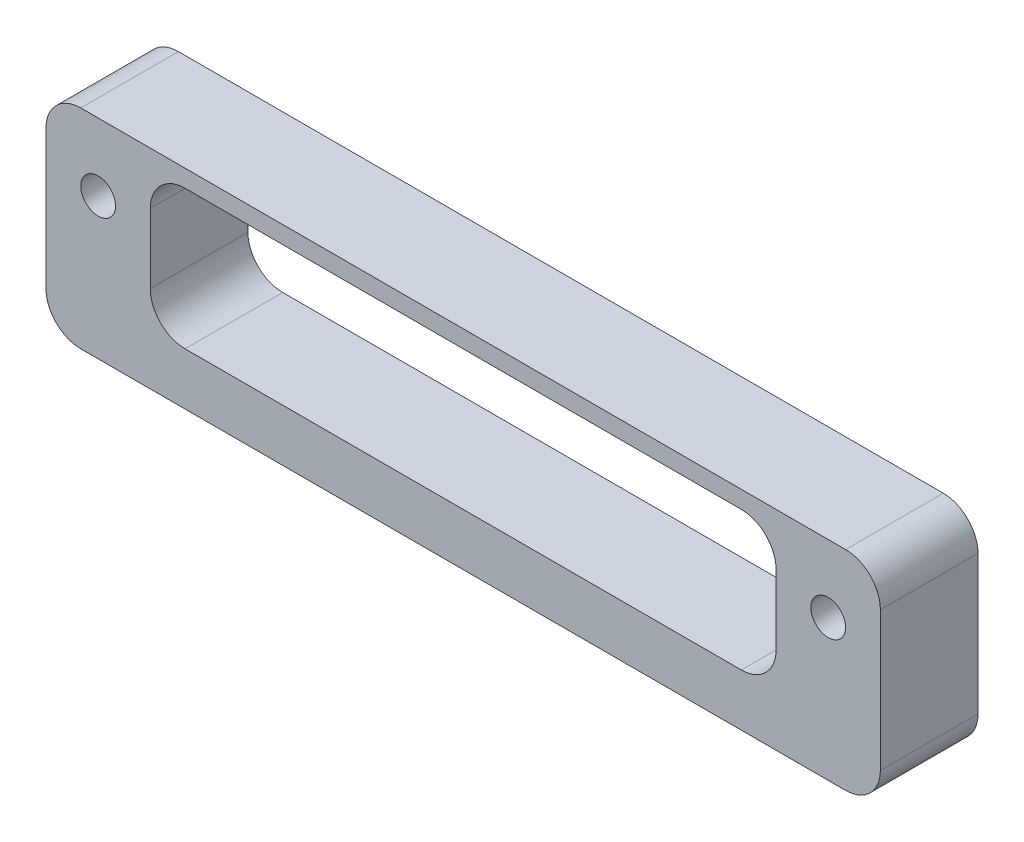
ISO-10303-21;
HEADER;
FILE_DESCRIPTION(('STEP AP214'),'2;1');
FILE_NAME('part.step','',(''),(''),'','','');
FILE_SCHEMA(('AUTOMOTIVE_DESIGN { 1 0 10303 214 1 1 1 1 }'));
ENDSEC;
DATA;
#1=APPLICATION_CONTEXT('core data for automotive mechanical design processes');
#2=APPLICATION_PROTOCOL_DEFINITION('international standard','automotive_design',2000,#1);
#3=PRODUCT_CONTEXT('',#1,'mechanical');
#4=PRODUCT('Part','Part','',(#3));
#5=PRODUCT_RELATED_PRODUCT_CATEGORY('part','',(#4));
#6=PRODUCT_DEFINITION_FORMATION('','',#4);
#7=PRODUCT_DEFINITION_CONTEXT('part definition',#1,'design');
#8=PRODUCT_DEFINITION('design','',#6,#7);
#9=PRODUCT_DEFINITION_SHAPE('','',#8);
#10=(LENGTH_UNIT() NAMED_UNIT(*) SI_UNIT(.MILLI.,.METRE.));
#11=(NAMED_UNIT(*) PLANE_ANGLE_UNIT() SI_UNIT($,.RADIAN.));
#12=(NAMED_UNIT(*) SI_UNIT($,.STERADIAN.) SOLID_ANGLE_UNIT());
#13=UNCERTAINTY_MEASURE_WITH_UNIT(LENGTH_MEASURE(1.E-05),#10,'distance_accuracy_value','');
#14=(GEOMETRIC_REPRESENTATION_CONTEXT(3) GLOBAL_UNCERTAINTY_ASSIGNED_CONTEXT((#13)) GLOBAL_UNIT_ASSIGNED_CONTEXT((#10,
#11,#12)) REPRESENTATION_CONTEXT('',''));
#15=CARTESIAN_POINT('',(0.,0.,0.));
#16=DIRECTION('',(0.,0.,1.));
#17=DIRECTION('',(1.,0.,0.));
#18=AXIS2_PLACEMENT_3D('',#15,#16,#17);
#19=CARTESIAN_POINT('',(-76.2,-19.05,17.8308));
#20=DIRECTION('',(1.,0.,0.));
#21=DIRECTION('',(0.,0.,-1.));
#22=AXIS2_PLACEMENT_3D('',#19,#20,#21);
#23=PLANE('',#22);
#24=DIRECTION('',(0.,-1.,0.));
#25=VECTOR('',#24,1.);
#26=CARTESIAN_POINT('',(-76.2,-19.05,0.));
#27=LINE('',#26,#25);
#28=CARTESIAN_POINT('',(-76.2,12.7,0.));
#29=VERTEX_POINT('',#28);
#30=CARTESIAN_POINT('',(-76.2,-12.7,0.));
#31=VERTEX_POINT('',#30);
#32=EDGE_CURVE('E177',#29,#31,#27,.T.);
#33=ORIENTED_EDGE('',*,*,#32,.T.);
#34=DIRECTION('',(0.,0.,-1.));
#35=VECTOR('',#34,1.);
#36=CARTESIAN_POINT('',(-76.2,-12.7,17.8308));
#37=LINE('',#36,#35);
#38=CARTESIAN_POINT('',(-76.2,-12.7,17.8308));
#39=VERTEX_POINT('',#38);
#40=EDGE_CURVE('E154',#31,#39,#37,.F.);
#41=ORIENTED_EDGE('',*,*,#40,.T.);
#42=DIRECTION('',(0.,-1.,0.));
#43=VECTOR('',#42,1.);
#44=CARTESIAN_POINT('',(-76.2,-19.05,17.8308));
#45=LINE('',#44,#43);
#46=CARTESIAN_POINT('',(-76.2,12.7,17.8308));
#47=VERTEX_POINT('',#46);
#48=EDGE_CURVE('E187',#47,#39,#45,.T.);
#49=ORIENTED_EDGE('',*,*,#48,.F.);
#50=DIRECTION('',(0.,0.,-1.));
#51=VECTOR('',#50,1.);
#52=CARTESIAN_POINT('',(-76.2,12.7,17.8308));
#53=LINE('',#52,#51);
#54=EDGE_CURVE('E159',#47,#29,#53,.T.);
#55=ORIENTED_EDGE('',*,*,#54,.T.);
#56=EDGE_LOOP('',(#33,#41,#49,#55));
#57=FACE_BOUND('',#56,.T.);
#58=ADVANCED_FACE('F35',(#57),#23,.F.);
#59=CARTESIAN_POINT('',(76.2,-19.05,17.8308));
#60=DIRECTION('',(0.,1.,0.));
#61=DIRECTION('',(-1.,0.,0.));
#62=AXIS2_PLACEMENT_3D('',#59,#60,#61);
#63=PLANE('',#62);
#64=DIRECTION('',(1.,0.,0.));
#65=VECTOR('',#64,1.);
#66=CARTESIAN_POINT('',(76.2,-19.05,17.8308));
#67=LINE('',#66,#65);
#68=CARTESIAN_POINT('',(-69.85,-19.05,17.8308));
#69=VERTEX_POINT('',#68);
#70=CARTESIAN_POINT('',(69.85,-19.05,17.8308));
#71=VERTEX_POINT('',#70);
#72=EDGE_CURVE('E169',#69,#71,#67,.T.);
#73=ORIENTED_EDGE('',*,*,#72,.F.);
#74=DIRECTION('',(0.,0.,-1.));
#75=VECTOR('',#74,1.);
#76=CARTESIAN_POINT('',(-69.85,-19.05,17.8308));
#77=LINE('',#76,#75);
#78=CARTESIAN_POINT('',(-69.85,-19.05,0.));
#79=VERTEX_POINT('',#78);
#80=EDGE_CURVE('E153',#69,#79,#77,.T.);
#81=ORIENTED_EDGE('',*,*,#80,.T.);
#82=DIRECTION('',(1.,0.,0.));
#83=VECTOR('',#82,1.);
#84=CARTESIAN_POINT('',(76.2,-19.05,0.));
#85=LINE('',#84,#83);
#86=CARTESIAN_POINT('',(69.85,-19.05,0.));
#87=VERTEX_POINT('',#86);
#88=EDGE_CURVE('E166',#79,#87,#85,.T.);
#89=ORIENTED_EDGE('',*,*,#88,.T.);
#90=DIRECTION('',(0.,0.,-1.));
#91=VECTOR('',#90,1.);
#92=CARTESIAN_POINT('',(69.85,-19.05,17.8308));
#93=LINE('',#92,#91);
#94=EDGE_CURVE('E171',#87,#71,#93,.F.);
#95=ORIENTED_EDGE('',*,*,#94,.T.);
#96=EDGE_LOOP('',(#73,#81,#89,#95));
#97=FACE_BOUND('',#96,.T.);
#98=ADVANCED_FACE('F165',(#97),#63,.F.);
#99=CARTESIAN_POINT('',(76.2,-19.05,17.8308));
#100=DIRECTION('',(-1.,0.,0.));
#101=DIRECTION('',(0.,0.,1.));
#102=AXIS2_PLACEMENT_3D('',#99,#100,#101);
#103=PLANE('',#102);
#104=DIRECTION('',(0.,1.,0.));
#105=VECTOR('',#104,1.);
#106=CARTESIAN_POINT('',(76.2,-19.05,17.8308));
#107=LINE('',#106,#105);
#108=CARTESIAN_POINT('',(76.2,-12.7,17.8308));
#109=VERTEX_POINT('',#108);
#110=CARTESIAN_POINT('',(76.2,12.7,17.8308));
#111=VERTEX_POINT('',#110);
#112=EDGE_CURVE('E292',#109,#111,#107,.T.);
#113=ORIENTED_EDGE('',*,*,#112,.F.);
#114=DIRECTION('',(0.,0.,-1.));
#115=VECTOR('',#114,1.);
#116=CARTESIAN_POINT('',(76.2,-12.7,17.8308));
#117=LINE('',#116,#115);
#118=CARTESIAN_POINT('',(76.2,-12.7,0.));
#119=VERTEX_POINT('',#118);
#120=EDGE_CURVE('E224',#109,#119,#117,.T.);
#121=ORIENTED_EDGE('',*,*,#120,.T.);
#122=DIRECTION('',(0.,1.,0.));
#123=VECTOR('',#122,1.);
#124=CARTESIAN_POINT('',(76.2,-19.05,0.));
#125=LINE('',#124,#123);
#126=CARTESIAN_POINT('',(76.2,12.7,0.));
#127=VERTEX_POINT('',#126);
#128=EDGE_CURVE('E176',#119,#127,#125,.T.);
#129=ORIENTED_EDGE('',*,*,#128,.T.);
#130=DIRECTION('',(0.,0.,-1.));
#131=VECTOR('',#130,1.);
#132=CARTESIAN_POINT('',(76.2,12.7,17.8308));
#133=LINE('',#132,#131);
#134=EDGE_CURVE('E222',#127,#111,#133,.F.);
#135=ORIENTED_EDGE('',*,*,#134,.T.);
#136=EDGE_LOOP('',(#113,#121,#129,#135));
#137=FACE_BOUND('',#136,.T.);
#138=ADVANCED_FACE('F307',(#137),#103,.F.);
#139=CARTESIAN_POINT('',(76.2,19.05,17.8308));
#140=DIRECTION('',(0.,-1.,0.));
#141=DIRECTION('',(1.,0.,0.));
#142=AXIS2_PLACEMENT_3D('',#139,#140,#141);
#143=PLANE('',#142);
#144=DIRECTION('',(-1.,0.,0.));
#145=VECTOR('',#144,1.);
#146=CARTESIAN_POINT('',(76.2,19.05,0.));
#147=LINE('',#146,#145);
#148=CARTESIAN_POINT('',(69.85,19.05,0.));
#149=VERTEX_POINT('',#148);
#150=CARTESIAN_POINT('',(-69.85,19.05,0.));
#151=VERTEX_POINT('',#150);
#152=EDGE_CURVE('E180',#149,#151,#147,.T.);
#153=ORIENTED_EDGE('',*,*,#152,.T.);
#154=DIRECTION('',(0.,0.,-1.));
#155=VECTOR('',#154,1.);
#156=CARTESIAN_POINT('',(-69.85,19.05,17.8308));
#157=LINE('',#156,#155);
#158=CARTESIAN_POINT('',(-69.85,19.05,17.8308));
#159=VERTEX_POINT('',#158);
#160=EDGE_CURVE('E50',#151,#159,#157,.F.);
#161=ORIENTED_EDGE('',*,*,#160,.T.);
#162=DIRECTION('',(-1.,0.,0.));
#163=VECTOR('',#162,1.);
#164=CARTESIAN_POINT('',(76.2,19.05,17.8308));
#165=LINE('',#164,#163);
#166=CARTESIAN_POINT('',(69.85,19.05,17.8308));
#167=VERTEX_POINT('',#166);
#168=EDGE_CURVE('E188',#167,#159,#165,.T.);
#169=ORIENTED_EDGE('',*,*,#168,.F.);
#170=DIRECTION('',(0.,0.,-1.));
#171=VECTOR('',#170,1.);
#172=CARTESIAN_POINT('',(69.85,19.05,17.8308));
#173=LINE('',#172,#171);
#174=EDGE_CURVE('E203',#167,#149,#173,.T.);
#175=ORIENTED_EDGE('',*,*,#174,.T.);
#176=EDGE_LOOP('',(#153,#161,#169,#175));
#177=FACE_BOUND('',#176,.T.);
#178=ADVANCED_FACE('F301',(#177),#143,.F.);
#179=CARTESIAN_POINT('',(0.,0.,17.8308));
#180=DIRECTION('',(0.,0.,1.));
#181=DIRECTION('',(1.,0.,0.));
#182=AXIS2_PLACEMENT_3D('',#179,#180,#181);
#183=PLANE('',#182);
#184=CARTESIAN_POINT('',(66.675,6.71301999999999,17.8308));
#185=DIRECTION('',(0.,0.,1.));
#186=DIRECTION('',(1.,0.,0.));
#187=AXIS2_PLACEMENT_3D('',#184,#185,#186);
#188=CIRCLE('',#187,3.175);
#189=CARTESIAN_POINT('',(69.85,6.71301999999999,17.8308));
#190=VERTEX_POINT('',#189);
#191=EDGE_CURVE('E505',#190,#190,#188,.T.);
#192=ORIENTED_EDGE('',*,*,#191,.F.);
#193=EDGE_LOOP('',(#192));
#194=FACE_BOUND('',#193,.T.);
#195=CARTESIAN_POINT('',(-66.675,6.71301999999999,17.8308));
#196=DIRECTION('',(0.,0.,1.));
#197=DIRECTION('',(1.,0.,0.));
#198=AXIS2_PLACEMENT_3D('',#195,#196,#197);
#199=CIRCLE('',#198,3.175);
#200=CARTESIAN_POINT('',(-63.5,6.71301999999999,17.8308));
#201=VERTEX_POINT('',#200);
#202=EDGE_CURVE('E277',#201,#201,#199,.T.);
#203=ORIENTED_EDGE('',*,*,#202,.F.);
#204=EDGE_LOOP('',(#203));
#205=FACE_BOUND('',#204,.T.);
#206=DIRECTION('',(0.,-1.,0.));
#207=VECTOR('',#206,1.);
#208=CARTESIAN_POINT('',(-57.15,15.875,17.8308));
#209=LINE('',#208,#207);
#210=CARTESIAN_POINT('',(-57.15,9.52499999999999,17.8308));
#211=VERTEX_POINT('',#210);
#212=CARTESIAN_POINT('',(-57.15,-3.17500000000001,17.8308));
#213=VERTEX_POINT('',#212);
#214=EDGE_CURVE('E250',#211,#213,#209,.T.);
#215=ORIENTED_EDGE('',*,*,#214,.F.);
#216=CARTESIAN_POINT('',(-50.8,9.52499999999999,17.8308));
#217=DIRECTION('',(0.,0.,1.));
#218=DIRECTION('',(1.,0.,0.));
#219=AXIS2_PLACEMENT_3D('',#216,#217,#218);
#220=CIRCLE('',#219,6.35);
#221=CARTESIAN_POINT('',(-50.8,15.875,17.8308));
#222=VERTEX_POINT('',#221);
#223=EDGE_CURVE('E43',#211,#222,#220,.F.);
#224=ORIENTED_EDGE('',*,*,#223,.T.);
#225=DIRECTION('',(-1.,0.,0.));
#226=VECTOR('',#225,1.);
#227=CARTESIAN_POINT('',(-57.15,15.875,17.8308));
#228=LINE('',#227,#226);
#229=CARTESIAN_POINT('',(50.8,15.875,17.8308));
#230=VERTEX_POINT('',#229);
#231=EDGE_CURVE('E248',#230,#222,#228,.T.);
#232=ORIENTED_EDGE('',*,*,#231,.F.);
#233=CARTESIAN_POINT('',(50.8,9.525,17.8308));
#234=DIRECTION('',(0.,0.,1.));
#235=DIRECTION('',(1.,0.,0.));
#236=AXIS2_PLACEMENT_3D('',#233,#234,#235);
#237=CIRCLE('',#236,6.35);
#238=CARTESIAN_POINT('',(57.15,9.525,17.8308));
#239=VERTEX_POINT('',#238);
#240=EDGE_CURVE('E240',#230,#239,#237,.F.);
#241=ORIENTED_EDGE('',*,*,#240,.T.);
#242=DIRECTION('',(0.,1.,0.));
#243=VECTOR('',#242,1.);
#244=CARTESIAN_POINT('',(57.15,15.875,17.8308));
#245=LINE('',#244,#243);
#246=CARTESIAN_POINT('',(57.15,-3.175,17.8308));
#247=VERTEX_POINT('',#246);
#248=EDGE_CURVE('E260',#247,#239,#245,.T.);
#249=ORIENTED_EDGE('',*,*,#248,.F.);
#250=CARTESIAN_POINT('',(50.8,-3.175,17.8308));
#251=DIRECTION('',(0.,0.,1.));
#252=DIRECTION('',(1.,0.,0.));
#253=AXIS2_PLACEMENT_3D('',#250,#251,#252);
#254=CIRCLE('',#253,6.35);
#255=CARTESIAN_POINT('',(50.8,-9.525,17.8308));
#256=VERTEX_POINT('',#255);
#257=EDGE_CURVE('E236',#247,#256,#254,.F.);
#258=ORIENTED_EDGE('',*,*,#257,.T.);
#259=DIRECTION('',(1.,0.,0.));
#260=VECTOR('',#259,1.);
#261=CARTESIAN_POINT('',(-57.15,-9.52500000000001,17.8308));
#262=LINE('',#261,#260);
#263=CARTESIAN_POINT('',(-50.8,-9.52500000000001,17.8308));
#264=VERTEX_POINT('',#263);
#265=EDGE_CURVE('E283',#264,#256,#262,.T.);
#266=ORIENTED_EDGE('',*,*,#265,.F.);
#267=CARTESIAN_POINT('',(-50.8,-3.17500000000001,17.8308));
#268=DIRECTION('',(0.,0.,1.));
#269=DIRECTION('',(1.,0.,0.));
#270=AXIS2_PLACEMENT_3D('',#267,#268,#269);
#271=CIRCLE('',#270,6.35);
#272=EDGE_CURVE('E232',#264,#213,#271,.F.);
#273=ORIENTED_EDGE('',*,*,#272,.T.);
#274=EDGE_LOOP('',(#215,#224,#232,#241,#249,#258,#266,#273));
#275=FACE_BOUND('',#274,.T.);
#276=ORIENTED_EDGE('',*,*,#48,.T.);
#277=CARTESIAN_POINT('',(-69.85,-12.7,17.8308));
#278=DIRECTION('',(0.,0.,1.));
#279=DIRECTION('',(1.,0.,0.));
#280=AXIS2_PLACEMENT_3D('',#277,#278,#279);
#281=CIRCLE('',#280,6.35);
#282=EDGE_CURVE('E201',#39,#69,#281,.T.);
#283=ORIENTED_EDGE('',*,*,#282,.T.);
#284=ORIENTED_EDGE('',*,*,#72,.T.);
#285=CARTESIAN_POINT('',(69.85,-12.7,17.8308));
#286=DIRECTION('',(0.,0.,1.));
#287=DIRECTION('',(1.,0.,0.));
#288=AXIS2_PLACEMENT_3D('',#285,#286,#287);
#289=CIRCLE('',#288,6.35);
#290=EDGE_CURVE('E197',#71,#109,#289,.T.);
#291=ORIENTED_EDGE('',*,*,#290,.T.);
#292=ORIENTED_EDGE('',*,*,#112,.T.);
#293=CARTESIAN_POINT('',(69.85,12.7,17.8308));
#294=DIRECTION('',(0.,0.,1.));
#295=DIRECTION('',(1.,0.,0.));
#296=AXIS2_PLACEMENT_3D('',#293,#294,#295);
#297=CIRCLE('',#296,6.35);
#298=EDGE_CURVE('E57',#111,#167,#297,.T.);
#299=ORIENTED_EDGE('',*,*,#298,.T.);
#300=ORIENTED_EDGE('',*,*,#168,.T.);
#301=CARTESIAN_POINT('',(-69.85,12.7,17.8308));
#302=DIRECTION('',(0.,0.,1.));
#303=DIRECTION('',(1.,0.,0.));
#304=AXIS2_PLACEMENT_3D('',#301,#302,#303);
#305=CIRCLE('',#304,6.35);
#306=EDGE_CURVE('E199',#159,#47,#305,.T.);
#307=ORIENTED_EDGE('',*,*,#306,.T.);
#308=EDGE_LOOP('',(#276,#283,#284,#291,#292,#299,#300,#307));
#309=FACE_BOUND('',#308,.T.);
#310=ADVANCED_FACE('F247',(#194,#205,#275,#309),#183,.T.);
#311=CARTESIAN_POINT('',(0.,0.,0.));
#312=DIRECTION('',(0.,0.,1.));
#313=DIRECTION('',(1.,0.,0.));
#314=AXIS2_PLACEMENT_3D('',#311,#312,#313);
#315=PLANE('',#314);
#316=CARTESIAN_POINT('',(66.675,6.71301999999999,0.));
#317=DIRECTION('',(0.,0.,1.));
#318=DIRECTION('',(1.,0.,0.));
#319=AXIS2_PLACEMENT_3D('',#316,#317,#318);
#320=CIRCLE('',#319,3.175);
#321=CARTESIAN_POINT('',(69.85,6.71301999999999,0.));
#322=VERTEX_POINT('',#321);
#323=EDGE_CURVE('E501',#322,#322,#320,.T.);
#324=ORIENTED_EDGE('',*,*,#323,.T.);
#325=EDGE_LOOP('',(#324));
#326=FACE_BOUND('',#325,.T.);
#327=CARTESIAN_POINT('',(-66.675,6.71301999999999,0.));
#328=DIRECTION('',(0.,0.,1.));
#329=DIRECTION('',(1.,0.,0.));
#330=AXIS2_PLACEMENT_3D('',#327,#328,#329);
#331=CIRCLE('',#330,3.175);
#332=CARTESIAN_POINT('',(-63.5,6.71301999999999,0.));
#333=VERTEX_POINT('',#332);
#334=EDGE_CURVE('E284',#333,#333,#331,.T.);
#335=ORIENTED_EDGE('',*,*,#334,.T.);
#336=EDGE_LOOP('',(#335));
#337=FACE_BOUND('',#336,.T.);
#338=DIRECTION('',(0.,1.,0.));
#339=VECTOR('',#338,1.);
#340=CARTESIAN_POINT('',(57.15,15.875,0.));
#341=LINE('',#340,#339);
#342=CARTESIAN_POINT('',(57.15,-3.175,0.));
#343=VERTEX_POINT('',#342);
#344=CARTESIAN_POINT('',(57.15,9.525,0.));
#345=VERTEX_POINT('',#344);
#346=EDGE_CURVE('E274',#343,#345,#341,.T.);
#347=ORIENTED_EDGE('',*,*,#346,.T.);
#348=CARTESIAN_POINT('',(50.8,9.525,0.));
#349=DIRECTION('',(0.,0.,1.));
#350=DIRECTION('',(1.,0.,0.));
#351=AXIS2_PLACEMENT_3D('',#348,#349,#350);
#352=CIRCLE('',#351,6.35);
#353=CARTESIAN_POINT('',(50.8,15.875,0.));
#354=VERTEX_POINT('',#353);
#355=EDGE_CURVE('E242',#345,#354,#352,.T.);
#356=ORIENTED_EDGE('',*,*,#355,.T.);
#357=DIRECTION('',(-1.,0.,0.));
#358=VECTOR('',#357,1.);
#359=CARTESIAN_POINT('',(-57.15,15.875,0.));
#360=LINE('',#359,#358);
#361=CARTESIAN_POINT('',(-50.8,15.875,0.));
#362=VERTEX_POINT('',#361);
#363=EDGE_CURVE('E182',#354,#362,#360,.T.);
#364=ORIENTED_EDGE('',*,*,#363,.T.);
#365=CARTESIAN_POINT('',(-50.8,9.52499999999999,0.));
#366=DIRECTION('',(0.,0.,1.));
#367=DIRECTION('',(1.,0.,0.));
#368=AXIS2_PLACEMENT_3D('',#365,#366,#367);
#369=CIRCLE('',#368,6.35);
#370=CARTESIAN_POINT('',(-57.15,9.52499999999999,0.));
#371=VERTEX_POINT('',#370);
#372=EDGE_CURVE('E11',#362,#371,#369,.T.);
#373=ORIENTED_EDGE('',*,*,#372,.T.);
#374=DIRECTION('',(0.,-1.,0.));
#375=VECTOR('',#374,1.);
#376=CARTESIAN_POINT('',(-57.15,15.875,0.));
#377=LINE('',#376,#375);
#378=CARTESIAN_POINT('',(-57.15,-3.17500000000001,0.));
#379=VERTEX_POINT('',#378);
#380=EDGE_CURVE('E259',#371,#379,#377,.T.);
#381=ORIENTED_EDGE('',*,*,#380,.T.);
#382=CARTESIAN_POINT('',(-50.8,-3.17500000000001,0.));
#383=DIRECTION('',(0.,0.,1.));
#384=DIRECTION('',(1.,0.,0.));
#385=AXIS2_PLACEMENT_3D('',#382,#383,#384);
#386=CIRCLE('',#385,6.35);
#387=CARTESIAN_POINT('',(-50.8,-9.52500000000001,0.));
#388=VERTEX_POINT('',#387);
#389=EDGE_CURVE('E234',#379,#388,#386,.T.);
#390=ORIENTED_EDGE('',*,*,#389,.T.);
#391=DIRECTION('',(1.,0.,0.));
#392=VECTOR('',#391,1.);
#393=CARTESIAN_POINT('',(-57.15,-9.52500000000001,0.));
#394=LINE('',#393,#392);
#395=CARTESIAN_POINT('',(50.8,-9.525,0.));
#396=VERTEX_POINT('',#395);
#397=EDGE_CURVE('E271',#388,#396,#394,.T.);
#398=ORIENTED_EDGE('',*,*,#397,.T.);
#399=CARTESIAN_POINT('',(50.8,-3.175,0.));
#400=DIRECTION('',(0.,0.,1.));
#401=DIRECTION('',(1.,0.,0.));
#402=AXIS2_PLACEMENT_3D('',#399,#400,#401);
#403=CIRCLE('',#402,6.35);
#404=EDGE_CURVE('E238',#396,#343,#403,.T.);
#405=ORIENTED_EDGE('',*,*,#404,.T.);
#406=EDGE_LOOP('',(#347,#356,#364,#373,#381,#390,#398,#405));
#407=FACE_BOUND('',#406,.T.);
#408=ORIENTED_EDGE('',*,*,#88,.F.);
#409=CARTESIAN_POINT('',(-69.85,-12.7,0.));
#410=DIRECTION('',(0.,0.,1.));
#411=DIRECTION('',(1.,0.,0.));
#412=AXIS2_PLACEMENT_3D('',#409,#410,#411);
#413=CIRCLE('',#412,6.35);
#414=EDGE_CURVE('E149',#79,#31,#413,.F.);
#415=ORIENTED_EDGE('',*,*,#414,.T.);
#416=ORIENTED_EDGE('',*,*,#32,.F.);
#417=CARTESIAN_POINT('',(-69.85,12.7,0.));
#418=DIRECTION('',(0.,0.,1.));
#419=DIRECTION('',(1.,0.,0.));
#420=AXIS2_PLACEMENT_3D('',#417,#418,#419);
#421=CIRCLE('',#420,6.35);
#422=EDGE_CURVE('E160',#29,#151,#421,.F.);
#423=ORIENTED_EDGE('',*,*,#422,.T.);
#424=ORIENTED_EDGE('',*,*,#152,.F.);
#425=CARTESIAN_POINT('',(69.85,12.7,0.));
#426=DIRECTION('',(0.,0.,1.));
#427=DIRECTION('',(1.,0.,0.));
#428=AXIS2_PLACEMENT_3D('',#425,#426,#427);
#429=CIRCLE('',#428,6.35);
#430=EDGE_CURVE('E170',#149,#127,#429,.F.);
#431=ORIENTED_EDGE('',*,*,#430,.T.);
#432=ORIENTED_EDGE('',*,*,#128,.F.);
#433=CARTESIAN_POINT('',(69.85,-12.7,0.));
#434=DIRECTION('',(0.,0.,1.));
#435=DIRECTION('',(1.,0.,0.));
#436=AXIS2_PLACEMENT_3D('',#433,#434,#435);
#437=CIRCLE('',#436,6.35);
#438=EDGE_CURVE('E175',#119,#87,#437,.F.);
#439=ORIENTED_EDGE('',*,*,#438,.T.);
#440=EDGE_LOOP('',(#408,#415,#416,#423,#424,#431,#432,#439));
#441=FACE_BOUND('',#440,.T.);
#442=ADVANCED_FACE('F173',(#326,#337,#407,#441),#315,.F.);
#443=CARTESIAN_POINT('',(-57.15,15.875,0.));
#444=DIRECTION('',(-1.,0.,0.));
#445=DIRECTION('',(0.,0.,1.));
#446=AXIS2_PLACEMENT_3D('',#443,#444,#445);
#447=PLANE('',#446);
#448=ORIENTED_EDGE('',*,*,#214,.T.);
#449=DIRECTION('',(0.,0.,1.));
#450=VECTOR('',#449,1.);
#451=CARTESIAN_POINT('',(-57.15,-3.17500000000001,0.));
#452=LINE('',#451,#450);
#453=EDGE_CURVE('E215',#213,#379,#452,.F.);
#454=ORIENTED_EDGE('',*,*,#453,.T.);
#455=ORIENTED_EDGE('',*,*,#380,.F.);
#456=DIRECTION('',(0.,0.,1.));
#457=VECTOR('',#456,1.);
#458=CARTESIAN_POINT('',(-57.15,9.52499999999999,17.8308));
#459=LINE('',#458,#457);
#460=EDGE_CURVE('E212',#371,#211,#459,.T.);
#461=ORIENTED_EDGE('',*,*,#460,.T.);
#462=EDGE_LOOP('',(#448,#454,#455,#461));
#463=FACE_BOUND('',#462,.T.);
#464=ADVANCED_FACE('F269',(#463),#447,.F.);
#465=CARTESIAN_POINT('',(-57.15,15.875,0.));
#466=DIRECTION('',(0.,1.,0.));
#467=DIRECTION('',(-1.,0.,0.));
#468=AXIS2_PLACEMENT_3D('',#465,#466,#467);
#469=PLANE('',#468);
#470=ORIENTED_EDGE('',*,*,#363,.F.);
#471=DIRECTION('',(0.,0.,1.));
#472=VECTOR('',#471,1.);
#473=CARTESIAN_POINT('',(50.8,15.875,17.8308));
#474=LINE('',#473,#472);
#475=EDGE_CURVE('E229',#354,#230,#474,.T.);
#476=ORIENTED_EDGE('',*,*,#475,.T.);
#477=ORIENTED_EDGE('',*,*,#231,.T.);
#478=DIRECTION('',(0.,0.,1.));
#479=VECTOR('',#478,1.);
#480=CARTESIAN_POINT('',(-50.8,15.875,0.));
#481=LINE('',#480,#479);
#482=EDGE_CURVE('E227',#222,#362,#481,.F.);
#483=ORIENTED_EDGE('',*,*,#482,.T.);
#484=EDGE_LOOP('',(#470,#476,#477,#483));
#485=FACE_BOUND('',#484,.T.);
#486=ADVANCED_FACE('F256',(#485),#469,.F.);
#487=CARTESIAN_POINT('',(57.15,15.875,0.));
#488=DIRECTION('',(1.,0.,0.));
#489=DIRECTION('',(0.,1.,0.));
#490=AXIS2_PLACEMENT_3D('',#487,#488,#489);
#491=PLANE('',#490);
#492=ORIENTED_EDGE('',*,*,#346,.F.);
#493=DIRECTION('',(0.,0.,1.));
#494=VECTOR('',#493,1.);
#495=CARTESIAN_POINT('',(57.15,-3.175,17.8308));
#496=LINE('',#495,#494);
#497=EDGE_CURVE('E219',#343,#247,#496,.T.);
#498=ORIENTED_EDGE('',*,*,#497,.T.);
#499=ORIENTED_EDGE('',*,*,#248,.T.);
#500=DIRECTION('',(0.,0.,1.));
#501=VECTOR('',#500,1.);
#502=CARTESIAN_POINT('',(57.15,9.525,0.));
#503=LINE('',#502,#501);
#504=EDGE_CURVE('E217',#239,#345,#503,.F.);
#505=ORIENTED_EDGE('',*,*,#504,.T.);
#506=EDGE_LOOP('',(#492,#498,#499,#505));
#507=FACE_BOUND('',#506,.T.);
#508=ADVANCED_FACE('F351',(#507),#491,.F.);
#509=CARTESIAN_POINT('',(-57.15,-9.52500000000001,0.));
#510=DIRECTION('',(0.,-1.,0.));
#511=DIRECTION('',(1.,0.,0.));
#512=AXIS2_PLACEMENT_3D('',#509,#510,#511);
#513=PLANE('',#512);
#514=ORIENTED_EDGE('',*,*,#397,.F.);
#515=DIRECTION('',(0.,0.,1.));
#516=VECTOR('',#515,1.);
#517=CARTESIAN_POINT('',(-50.8,-9.52500000000001,17.8308));
#518=LINE('',#517,#516);
#519=EDGE_CURVE('E209',#388,#264,#518,.T.);
#520=ORIENTED_EDGE('',*,*,#519,.T.);
#521=ORIENTED_EDGE('',*,*,#265,.T.);
#522=DIRECTION('',(0.,0.,1.));
#523=VECTOR('',#522,1.);
#524=CARTESIAN_POINT('',(50.8,-9.525,0.));
#525=LINE('',#524,#523);
#526=EDGE_CURVE('E207',#256,#396,#525,.F.);
#527=ORIENTED_EDGE('',*,*,#526,.T.);
#528=EDGE_LOOP('',(#514,#520,#521,#527));
#529=FACE_BOUND('',#528,.T.);
#530=ADVANCED_FACE('F334',(#529),#513,.F.);
#531=CARTESIAN_POINT('',(-69.85,-12.7,17.8308));
#532=DIRECTION('',(0.,0.,-1.));
#533=DIRECTION('',(-1.,0.,0.));
#534=AXIS2_PLACEMENT_3D('',#531,#532,#533);
#535=CYLINDRICAL_SURFACE('',#534,6.35);
#536=ORIENTED_EDGE('',*,*,#282,.F.);
#537=ORIENTED_EDGE('',*,*,#40,.F.);
#538=ORIENTED_EDGE('',*,*,#414,.F.);
#539=ORIENTED_EDGE('',*,*,#80,.F.);
#540=EDGE_LOOP('',(#536,#537,#538,#539));
#541=FACE_BOUND('',#540,.T.);
#542=ADVANCED_FACE('F152',(#541),#535,.T.);
#543=CARTESIAN_POINT('',(-69.85,12.7,17.8308));
#544=DIRECTION('',(0.,0.,-1.));
#545=DIRECTION('',(-1.,0.,0.));
#546=AXIS2_PLACEMENT_3D('',#543,#544,#545);
#547=CYLINDRICAL_SURFACE('',#546,6.35);
#548=ORIENTED_EDGE('',*,*,#306,.F.);
#549=ORIENTED_EDGE('',*,*,#160,.F.);
#550=ORIENTED_EDGE('',*,*,#422,.F.);
#551=ORIENTED_EDGE('',*,*,#54,.F.);
#552=EDGE_LOOP('',(#548,#549,#550,#551));
#553=FACE_BOUND('',#552,.T.);
#554=ADVANCED_FACE('F298',(#553),#547,.T.);
#555=CARTESIAN_POINT('',(-50.8,-3.17500000000001,0.));
#556=DIRECTION('',(0.,0.,-1.));
#557=DIRECTION('',(-1.,0.,0.));
#558=AXIS2_PLACEMENT_3D('',#555,#556,#557);
#559=CYLINDRICAL_SURFACE('',#558,6.35);
#560=ORIENTED_EDGE('',*,*,#389,.F.);
#561=ORIENTED_EDGE('',*,*,#453,.F.);
#562=ORIENTED_EDGE('',*,*,#272,.F.);
#563=ORIENTED_EDGE('',*,*,#519,.F.);
#564=EDGE_LOOP('',(#560,#561,#562,#563));
#565=FACE_BOUND('',#564,.T.);
#566=ADVANCED_FACE('F321',(#565),#559,.F.);
#567=CARTESIAN_POINT('',(50.8,-3.175,0.));
#568=DIRECTION('',(0.,0.,-1.));
#569=DIRECTION('',(-1.,0.,0.));
#570=AXIS2_PLACEMENT_3D('',#567,#568,#569);
#571=CYLINDRICAL_SURFACE('',#570,6.35);
#572=ORIENTED_EDGE('',*,*,#404,.F.);
#573=ORIENTED_EDGE('',*,*,#526,.F.);
#574=ORIENTED_EDGE('',*,*,#257,.F.);
#575=ORIENTED_EDGE('',*,*,#497,.F.);
#576=EDGE_LOOP('',(#572,#573,#574,#575));
#577=FACE_BOUND('',#576,.T.);
#578=ADVANCED_FACE('F313',(#577),#571,.F.);
#579=CARTESIAN_POINT('',(69.85,-12.7,17.8308));
#580=DIRECTION('',(0.,0.,-1.));
#581=DIRECTION('',(-1.,0.,0.));
#582=AXIS2_PLACEMENT_3D('',#579,#580,#581);
#583=CYLINDRICAL_SURFACE('',#582,6.35);
#584=ORIENTED_EDGE('',*,*,#290,.F.);
#585=ORIENTED_EDGE('',*,*,#94,.F.);
#586=ORIENTED_EDGE('',*,*,#438,.F.);
#587=ORIENTED_EDGE('',*,*,#120,.F.);
#588=EDGE_LOOP('',(#584,#585,#586,#587));
#589=FACE_BOUND('',#588,.T.);
#590=ADVANCED_FACE('F311',(#589),#583,.T.);
#591=CARTESIAN_POINT('',(69.85,12.7,17.8308));
#592=DIRECTION('',(0.,0.,-1.));
#593=DIRECTION('',(-1.,0.,0.));
#594=AXIS2_PLACEMENT_3D('',#591,#592,#593);
#595=CYLINDRICAL_SURFACE('',#594,6.35);
#596=ORIENTED_EDGE('',*,*,#298,.F.);
#597=ORIENTED_EDGE('',*,*,#134,.F.);
#598=ORIENTED_EDGE('',*,*,#430,.F.);
#599=ORIENTED_EDGE('',*,*,#174,.F.);
#600=EDGE_LOOP('',(#596,#597,#598,#599));
#601=FACE_BOUND('',#600,.T.);
#602=ADVANCED_FACE('F303',(#601),#595,.T.);
#603=CARTESIAN_POINT('',(50.8,9.525,0.));
#604=DIRECTION('',(0.,0.,-1.));
#605=DIRECTION('',(-1.,0.,0.));
#606=AXIS2_PLACEMENT_3D('',#603,#604,#605);
#607=CYLINDRICAL_SURFACE('',#606,6.35);
#608=ORIENTED_EDGE('',*,*,#355,.F.);
#609=ORIENTED_EDGE('',*,*,#504,.F.);
#610=ORIENTED_EDGE('',*,*,#240,.F.);
#611=ORIENTED_EDGE('',*,*,#475,.F.);
#612=EDGE_LOOP('',(#608,#609,#610,#611));
#613=FACE_BOUND('',#612,.T.);
#614=ADVANCED_FACE('F319',(#613),#607,.F.);
#615=CARTESIAN_POINT('',(-50.8,9.52499999999999,0.));
#616=DIRECTION('',(0.,0.,-1.));
#617=DIRECTION('',(-1.,0.,0.));
#618=AXIS2_PLACEMENT_3D('',#615,#616,#617);
#619=CYLINDRICAL_SURFACE('',#618,6.35);
#620=ORIENTED_EDGE('',*,*,#372,.F.);
#621=ORIENTED_EDGE('',*,*,#482,.F.);
#622=ORIENTED_EDGE('',*,*,#223,.F.);
#623=ORIENTED_EDGE('',*,*,#460,.F.);
#624=EDGE_LOOP('',(#620,#621,#622,#623));
#625=FACE_BOUND('',#624,.T.);
#626=ADVANCED_FACE('F37',(#625),#619,.F.);
#627=CARTESIAN_POINT('',(-66.675,6.71301999999999,0.));
#628=DIRECTION('',(0.,0.,1.));
#629=DIRECTION('',(1.,0.,0.));
#630=AXIS2_PLACEMENT_3D('',#627,#628,#629);
#631=CYLINDRICAL_SURFACE('',#630,3.175);
#632=ORIENTED_EDGE('',*,*,#334,.F.);
#633=EDGE_LOOP('',(#632));
#634=FACE_BOUND('',#633,.T.);
#635=ORIENTED_EDGE('',*,*,#202,.T.);
#636=EDGE_LOOP('',(#635));
#637=FACE_BOUND('',#636,.T.);
#638=ADVANCED_FACE('F359',(#634,#637),#631,.F.);
#639=CARTESIAN_POINT('',(66.675,6.71301999999999,0.));
#640=DIRECTION('',(0.,0.,1.));
#641=DIRECTION('',(1.,0.,0.));
#642=AXIS2_PLACEMENT_3D('',#639,#640,#641);
#643=CYLINDRICAL_SURFACE('',#642,3.175);
#644=ORIENTED_EDGE('',*,*,#323,.F.);
#645=EDGE_LOOP('',(#644));
#646=FACE_BOUND('',#645,.T.);
#647=ORIENTED_EDGE('',*,*,#191,.T.);
#648=EDGE_LOOP('',(#647));
#649=FACE_BOUND('',#648,.T.);
#650=ADVANCED_FACE('F363',(#646,#649),#643,.F.);
#651=CLOSED_SHELL('',(#58,#98,#138,#178,#310,#442,#464,#486,#508,#530,#542,#554,#566,#578,#590,
#602,#614,#626,#638,#650));
#652=MANIFOLD_SOLID_BREP('B2',#651);
#653=ADVANCED_BREP_SHAPE_REPRESENTATION('',(#18,#652),#14);
#654=SHAPE_DEFINITION_REPRESENTATION(#9,#653);
ENDSEC;
END-ISO-10303-21;
